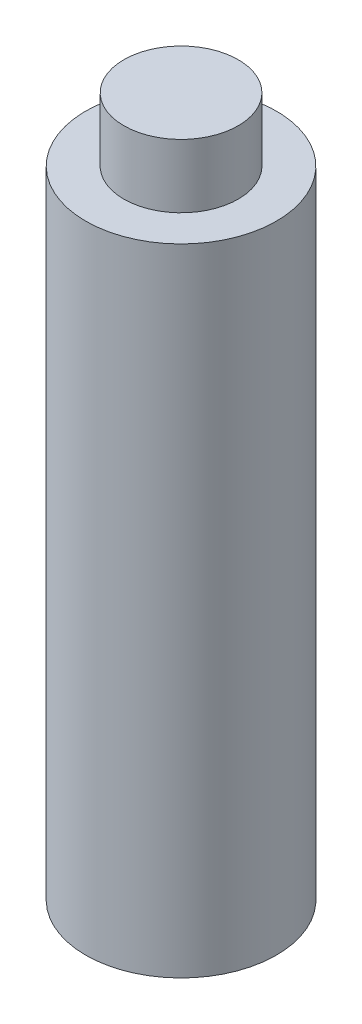
ISO-10303-21;
HEADER;
FILE_DESCRIPTION(('STEP AP214'),'2;1');
FILE_NAME('part.step','',(''),(''),'','','');
FILE_SCHEMA(('AUTOMOTIVE_DESIGN { 1 0 10303 214 1 1 1 1 }'));
ENDSEC;
DATA;
#1=APPLICATION_CONTEXT('core data for automotive mechanical design processes');
#2=APPLICATION_PROTOCOL_DEFINITION('international standard','automotive_design',2000,#1);
#3=PRODUCT_CONTEXT('',#1,'mechanical');
#4=PRODUCT('Part','Part','',(#3));
#5=PRODUCT_RELATED_PRODUCT_CATEGORY('part','',(#4));
#6=PRODUCT_DEFINITION_FORMATION('','',#4);
#7=PRODUCT_DEFINITION_CONTEXT('part definition',#1,'design');
#8=PRODUCT_DEFINITION('design','',#6,#7);
#9=PRODUCT_DEFINITION_SHAPE('','',#8);
#10=(LENGTH_UNIT() NAMED_UNIT(*) SI_UNIT(.MILLI.,.METRE.));
#11=(NAMED_UNIT(*) PLANE_ANGLE_UNIT() SI_UNIT($,.RADIAN.));
#12=(NAMED_UNIT(*) SI_UNIT($,.STERADIAN.) SOLID_ANGLE_UNIT());
#13=UNCERTAINTY_MEASURE_WITH_UNIT(LENGTH_MEASURE(1.E-05),#10,'distance_accuracy_value','');
#14=(GEOMETRIC_REPRESENTATION_CONTEXT(3) GLOBAL_UNCERTAINTY_ASSIGNED_CONTEXT((#13)) GLOBAL_UNIT_ASSIGNED_CONTEXT((#10,
#11,#12)) REPRESENTATION_CONTEXT('',''));
#15=CARTESIAN_POINT('',(0.,0.,0.));
#16=DIRECTION('',(0.,0.,1.));
#17=DIRECTION('',(1.,0.,0.));
#18=AXIS2_PLACEMENT_3D('',#15,#16,#17);
#19=CARTESIAN_POINT('',(0.,50.,0.));
#20=DIRECTION('',(0.,-1.,0.));
#21=DIRECTION('',(0.,0.,-1.));
#22=AXIS2_PLACEMENT_3D('',#19,#20,#21);
#23=CYLINDRICAL_SURFACE('',#22,7.5);
#24=CARTESIAN_POINT('',(0.,50.,0.));
#25=DIRECTION('',(0.,1.,0.));
#26=DIRECTION('',(0.,0.,1.));
#27=AXIS2_PLACEMENT_3D('',#24,#25,#26);
#28=CIRCLE('',#27,7.5);
#29=CARTESIAN_POINT('',(0.,50.,7.5));
#30=VERTEX_POINT('',#29);
#31=EDGE_CURVE('E42',#30,#30,#28,.T.);
#32=ORIENTED_EDGE('',*,*,#31,.F.);
#33=EDGE_LOOP('',(#32));
#34=FACE_BOUND('',#33,.T.);
#35=CARTESIAN_POINT('',(0.,0.,0.));
#36=DIRECTION('',(0.,1.,0.));
#37=DIRECTION('',(0.,0.,1.));
#38=AXIS2_PLACEMENT_3D('',#35,#36,#37);
#39=CIRCLE('',#38,7.5);
#40=CARTESIAN_POINT('',(0.,0.,7.5));
#41=VERTEX_POINT('',#40);
#42=EDGE_CURVE('E38',#41,#41,#39,.T.);
#43=ORIENTED_EDGE('',*,*,#42,.T.);
#44=EDGE_LOOP('',(#43));
#45=FACE_BOUND('',#44,.T.);
#46=ADVANCED_FACE('F35',(#34,#45),#23,.T.);
#47=CARTESIAN_POINT('',(0.,50.,0.));
#48=DIRECTION('',(0.,1.,0.));
#49=DIRECTION('',(0.,0.,1.));
#50=AXIS2_PLACEMENT_3D('',#47,#48,#49);
#51=PLANE('',#50);
#52=CARTESIAN_POINT('',(0.,50.,0.));
#53=DIRECTION('',(0.,1.,0.));
#54=DIRECTION('',(0.,0.,1.));
#55=AXIS2_PLACEMENT_3D('',#52,#53,#54);
#56=CIRCLE('',#55,4.5);
#57=CARTESIAN_POINT('',(0.,50.,4.5));
#58=VERTEX_POINT('',#57);
#59=EDGE_CURVE('E10',#58,#58,#56,.T.);
#60=ORIENTED_EDGE('',*,*,#59,.F.);
#61=EDGE_LOOP('',(#60));
#62=FACE_BOUND('',#61,.T.);
#63=ORIENTED_EDGE('',*,*,#31,.T.);
#64=EDGE_LOOP('',(#63));
#65=FACE_BOUND('',#64,.T.);
#66=ADVANCED_FACE('F59',(#62,#65),#51,.T.);
#67=CARTESIAN_POINT('',(0.,0.,0.));
#68=DIRECTION('',(0.,1.,0.));
#69=DIRECTION('',(0.,0.,1.));
#70=AXIS2_PLACEMENT_3D('',#67,#68,#69);
#71=PLANE('',#70);
#72=ORIENTED_EDGE('',*,*,#42,.F.);
#73=EDGE_LOOP('',(#72));
#74=FACE_BOUND('',#73,.T.);
#75=ADVANCED_FACE('F56',(#74),#71,.F.);
#76=CARTESIAN_POINT('',(0.,55.,0.));
#77=DIRECTION('',(0.,-1.,0.));
#78=DIRECTION('',(0.,0.,-1.));
#79=AXIS2_PLACEMENT_3D('',#76,#77,#78);
#80=CYLINDRICAL_SURFACE('',#79,4.5);
#81=CARTESIAN_POINT('',(0.,55.,0.));
#82=DIRECTION('',(0.,1.,0.));
#83=DIRECTION('',(0.,0.,1.));
#84=AXIS2_PLACEMENT_3D('',#81,#82,#83);
#85=CIRCLE('',#84,4.5);
#86=CARTESIAN_POINT('',(0.,55.,4.5));
#87=VERTEX_POINT('',#86);
#88=EDGE_CURVE('E48',#87,#87,#85,.T.);
#89=ORIENTED_EDGE('',*,*,#88,.F.);
#90=EDGE_LOOP('',(#89));
#91=FACE_BOUND('',#90,.T.);
#92=ORIENTED_EDGE('',*,*,#59,.T.);
#93=EDGE_LOOP('',(#92));
#94=FACE_BOUND('',#93,.T.);
#95=ADVANCED_FACE('F58',(#91,#94),#80,.T.);
#96=CARTESIAN_POINT('',(0.,55.,0.));
#97=DIRECTION('',(0.,1.,0.));
#98=DIRECTION('',(0.,0.,1.));
#99=AXIS2_PLACEMENT_3D('',#96,#97,#98);
#100=PLANE('',#99);
#101=ORIENTED_EDGE('',*,*,#88,.T.);
#102=EDGE_LOOP('',(#101));
#103=FACE_BOUND('',#102,.T.);
#104=ADVANCED_FACE('F64',(#103),#100,.T.);
#105=CLOSED_SHELL('',(#46,#66,#75,#95,#104));
#106=MANIFOLD_SOLID_BREP('B2',#105);
#107=ADVANCED_BREP_SHAPE_REPRESENTATION('',(#18,#106),#14);
#108=SHAPE_DEFINITION_REPRESENTATION(#9,#107);
ENDSEC;
END-ISO-10303-21;
